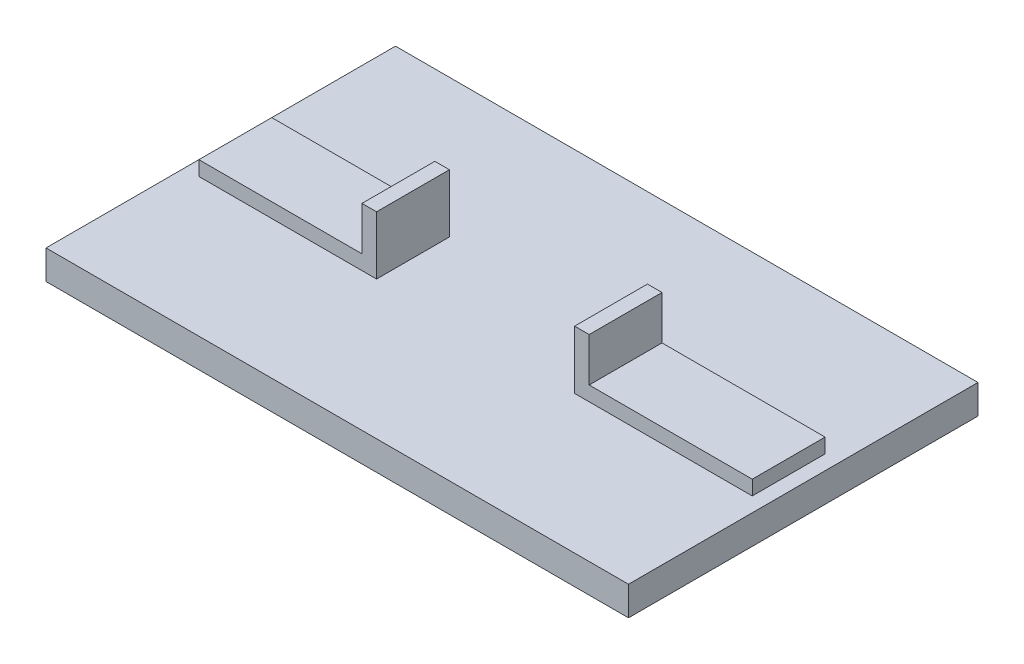
ISO-10303-21;
HEADER;
FILE_DESCRIPTION(('STEP AP214'),'2;1');
FILE_NAME('part.step','',(''),(''),'','','');
FILE_SCHEMA(('AUTOMOTIVE_DESIGN { 1 0 10303 214 1 1 1 1 }'));
ENDSEC;
DATA;
#1=APPLICATION_CONTEXT('core data for automotive mechanical design processes');
#2=APPLICATION_PROTOCOL_DEFINITION('international standard','automotive_design',2000,#1);
#3=PRODUCT_CONTEXT('',#1,'mechanical');
#4=PRODUCT('Part','Part','',(#3));
#5=PRODUCT_RELATED_PRODUCT_CATEGORY('part','',(#4));
#6=PRODUCT_DEFINITION_FORMATION('','',#4);
#7=PRODUCT_DEFINITION_CONTEXT('part definition',#1,'design');
#8=PRODUCT_DEFINITION('design','',#6,#7);
#9=PRODUCT_DEFINITION_SHAPE('','',#8);
#10=(LENGTH_UNIT() NAMED_UNIT(*) SI_UNIT(.MILLI.,.METRE.));
#11=(NAMED_UNIT(*) PLANE_ANGLE_UNIT() SI_UNIT($,.RADIAN.));
#12=(NAMED_UNIT(*) SI_UNIT($,.STERADIAN.) SOLID_ANGLE_UNIT());
#13=UNCERTAINTY_MEASURE_WITH_UNIT(LENGTH_MEASURE(1.E-05),#10,'distance_accuracy_value','');
#14=(GEOMETRIC_REPRESENTATION_CONTEXT(3) GLOBAL_UNCERTAINTY_ASSIGNED_CONTEXT((#13)) GLOBAL_UNIT_ASSIGNED_CONTEXT((#10,
#11,#12)) REPRESENTATION_CONTEXT('',''));
#15=CARTESIAN_POINT('',(0.,0.,0.));
#16=DIRECTION('',(0.,0.,1.));
#17=DIRECTION('',(1.,0.,0.));
#18=AXIS2_PLACEMENT_3D('',#15,#16,#17);
#19=CARTESIAN_POINT('',(0.,5.,0.));
#20=DIRECTION('',(0.,1.,0.));
#21=DIRECTION('',(0.,0.,1.));
#22=AXIS2_PLACEMENT_3D('',#19,#20,#21);
#23=PLANE('',#22);
#24=DIRECTION('',(0.,0.,-1.));
#25=VECTOR('',#24,1.);
#26=CARTESIAN_POINT('',(50.,5.,-30.));
#27=LINE('',#26,#25);
#28=CARTESIAN_POINT('',(50.,5.,30.));
#29=VERTEX_POINT('',#28);
#30=CARTESIAN_POINT('',(50.,5.,-30.));
#31=VERTEX_POINT('',#30);
#32=EDGE_CURVE('E309',#29,#31,#27,.T.);
#33=ORIENTED_EDGE('',*,*,#32,.T.);
#34=DIRECTION('',(-1.,0.,0.));
#35=VECTOR('',#34,1.);
#36=CARTESIAN_POINT('',(-50.,5.,-30.));
#37=LINE('',#36,#35);
#38=CARTESIAN_POINT('',(-50.,5.,-30.));
#39=VERTEX_POINT('',#38);
#40=EDGE_CURVE('E94',#31,#39,#37,.T.);
#41=ORIENTED_EDGE('',*,*,#40,.T.);
#42=DIRECTION('',(0.,0.,1.));
#43=VECTOR('',#42,1.);
#44=CARTESIAN_POINT('',(-50.,5.,-30.));
#45=LINE('',#44,#43);
#46=CARTESIAN_POINT('',(-50.,5.,30.));
#47=VERTEX_POINT('',#46);
#48=EDGE_CURVE('E314',#39,#47,#45,.T.);
#49=ORIENTED_EDGE('',*,*,#48,.T.);
#50=DIRECTION('',(1.,0.,0.));
#51=VECTOR('',#50,1.);
#52=CARTESIAN_POINT('',(-50.,5.,30.));
#53=LINE('',#52,#51);
#54=EDGE_CURVE('E63',#47,#29,#53,.T.);
#55=ORIENTED_EDGE('',*,*,#54,.T.);
#56=EDGE_LOOP('',(#33,#41,#49,#55));
#57=FACE_BOUND('',#56,.T.);
#58=DIRECTION('',(0.,0.,-1.));
#59=VECTOR('',#58,1.);
#60=CARTESIAN_POINT('',(-17.,5.,-6.254));
#61=LINE('',#60,#59);
#62=CARTESIAN_POINT('',(-17.,5.,6.254));
#63=VERTEX_POINT('',#62);
#64=CARTESIAN_POINT('',(-17.,5.,-6.254));
#65=VERTEX_POINT('',#64);
#66=EDGE_CURVE('E190',#63,#65,#61,.T.);
#67=ORIENTED_EDGE('',*,*,#66,.F.);
#68=DIRECTION('',(1.,0.,0.));
#69=VECTOR('',#68,1.);
#70=CARTESIAN_POINT('',(-19.5,5.,6.254));
#71=LINE('',#70,#69);
#72=CARTESIAN_POINT('',(-47.5,5.,6.254));
#73=VERTEX_POINT('',#72);
#74=EDGE_CURVE('E297',#73,#63,#71,.T.);
#75=ORIENTED_EDGE('',*,*,#74,.F.);
#76=DIRECTION('',(0.,0.,1.));
#77=VECTOR('',#76,1.);
#78=CARTESIAN_POINT('',(-47.5,5.,6.254));
#79=LINE('',#78,#77);
#80=CARTESIAN_POINT('',(-47.5,5.,-6.254));
#81=VERTEX_POINT('',#80);
#82=EDGE_CURVE('E179',#81,#73,#79,.T.);
#83=ORIENTED_EDGE('',*,*,#82,.F.);
#84=DIRECTION('',(-1.,0.,0.));
#85=VECTOR('',#84,1.);
#86=CARTESIAN_POINT('',(-47.5,5.,-6.254));
#87=LINE('',#86,#85);
#88=EDGE_CURVE('E282',#65,#81,#87,.T.);
#89=ORIENTED_EDGE('',*,*,#88,.F.);
#90=EDGE_LOOP('',(#67,#75,#83,#89));
#91=FACE_BOUND('',#90,.T.);
#92=DIRECTION('',(0.,0.,1.));
#93=VECTOR('',#92,1.);
#94=CARTESIAN_POINT('',(17.,5.,-6.254));
#95=LINE('',#94,#93);
#96=CARTESIAN_POINT('',(17.,5.,-6.254));
#97=VERTEX_POINT('',#96);
#98=CARTESIAN_POINT('',(17.,5.,6.25399999999999));
#99=VERTEX_POINT('',#98);
#100=EDGE_CURVE('E173',#97,#99,#95,.T.);
#101=ORIENTED_EDGE('',*,*,#100,.F.);
#102=DIRECTION('',(-1.,0.,0.));
#103=VECTOR('',#102,1.);
#104=CARTESIAN_POINT('',(47.5,5.,-6.25400000000001));
#105=LINE('',#104,#103);
#106=CARTESIAN_POINT('',(47.5,5.,-6.25400000000001));
#107=VERTEX_POINT('',#106);
#108=EDGE_CURVE('E258',#107,#97,#105,.T.);
#109=ORIENTED_EDGE('',*,*,#108,.F.);
#110=DIRECTION('',(0.,0.,-1.));
#111=VECTOR('',#110,1.);
#112=CARTESIAN_POINT('',(47.5,5.,6.25399999999999));
#113=LINE('',#112,#111);
#114=CARTESIAN_POINT('',(47.5,5.,6.25399999999999));
#115=VERTEX_POINT('',#114);
#116=EDGE_CURVE('E174',#115,#107,#113,.T.);
#117=ORIENTED_EDGE('',*,*,#116,.F.);
#118=DIRECTION('',(1.,0.,0.));
#119=VECTOR('',#118,1.);
#120=CARTESIAN_POINT('',(19.5,5.,6.25399999999999));
#121=LINE('',#120,#119);
#122=EDGE_CURVE('E170',#99,#115,#121,.T.);
#123=ORIENTED_EDGE('',*,*,#122,.F.);
#124=EDGE_LOOP('',(#101,#109,#117,#123));
#125=FACE_BOUND('',#124,.T.);
#126=ADVANCED_FACE('F45',(#57,#91,#125),#23,.T.);
#127=CARTESIAN_POINT('',(50.,5.,-30.));
#128=DIRECTION('',(-1.,0.,0.));
#129=DIRECTION('',(0.,0.,1.));
#130=AXIS2_PLACEMENT_3D('',#127,#128,#129);
#131=PLANE('',#130);
#132=DIRECTION('',(0.,0.,-1.));
#133=VECTOR('',#132,1.);
#134=CARTESIAN_POINT('',(50.,0.,-30.));
#135=LINE('',#134,#133);
#136=CARTESIAN_POINT('',(50.,0.,30.));
#137=VERTEX_POINT('',#136);
#138=CARTESIAN_POINT('',(50.,0.,-30.));
#139=VERTEX_POINT('',#138);
#140=EDGE_CURVE('E308',#137,#139,#135,.T.);
#141=ORIENTED_EDGE('',*,*,#140,.T.);
#142=DIRECTION('',(0.,-1.,0.));
#143=VECTOR('',#142,1.);
#144=CARTESIAN_POINT('',(50.,5.,-30.));
#145=LINE('',#144,#143);
#146=EDGE_CURVE('E11',#31,#139,#145,.T.);
#147=ORIENTED_EDGE('',*,*,#146,.F.);
#148=ORIENTED_EDGE('',*,*,#32,.F.);
#149=DIRECTION('',(0.,-1.,0.));
#150=VECTOR('',#149,1.);
#151=CARTESIAN_POINT('',(50.,5.,30.));
#152=LINE('',#151,#150);
#153=EDGE_CURVE('E319',#29,#137,#152,.T.);
#154=ORIENTED_EDGE('',*,*,#153,.T.);
#155=EDGE_LOOP('',(#141,#147,#148,#154));
#156=FACE_BOUND('',#155,.T.);
#157=ADVANCED_FACE('F47',(#156),#131,.F.);
#158=CARTESIAN_POINT('',(-50.,5.,-30.));
#159=DIRECTION('',(0.,0.,1.));
#160=DIRECTION('',(1.,0.,0.));
#161=AXIS2_PLACEMENT_3D('',#158,#159,#160);
#162=PLANE('',#161);
#163=DIRECTION('',(-1.,0.,0.));
#164=VECTOR('',#163,1.);
#165=CARTESIAN_POINT('',(-50.,0.,-30.));
#166=LINE('',#165,#164);
#167=CARTESIAN_POINT('',(-50.,0.,-30.));
#168=VERTEX_POINT('',#167);
#169=EDGE_CURVE('E323',#139,#168,#166,.T.);
#170=ORIENTED_EDGE('',*,*,#169,.T.);
#171=DIRECTION('',(0.,-1.,0.));
#172=VECTOR('',#171,1.);
#173=CARTESIAN_POINT('',(-50.,5.,-30.));
#174=LINE('',#173,#172);
#175=EDGE_CURVE('E55',#39,#168,#174,.T.);
#176=ORIENTED_EDGE('',*,*,#175,.F.);
#177=ORIENTED_EDGE('',*,*,#40,.F.);
#178=ORIENTED_EDGE('',*,*,#146,.T.);
#179=EDGE_LOOP('',(#170,#176,#177,#178));
#180=FACE_BOUND('',#179,.T.);
#181=ADVANCED_FACE('F352',(#180),#162,.F.);
#182=CARTESIAN_POINT('',(-50.,5.,-30.));
#183=DIRECTION('',(1.,0.,0.));
#184=DIRECTION('',(0.,0.,-1.));
#185=AXIS2_PLACEMENT_3D('',#182,#183,#184);
#186=PLANE('',#185);
#187=DIRECTION('',(0.,0.,1.));
#188=VECTOR('',#187,1.);
#189=CARTESIAN_POINT('',(-50.,0.,-30.));
#190=LINE('',#189,#188);
#191=CARTESIAN_POINT('',(-50.,0.,30.));
#192=VERTEX_POINT('',#191);
#193=EDGE_CURVE('E81',#168,#192,#190,.T.);
#194=ORIENTED_EDGE('',*,*,#193,.T.);
#195=DIRECTION('',(0.,-1.,0.));
#196=VECTOR('',#195,1.);
#197=CARTESIAN_POINT('',(-50.,5.,30.));
#198=LINE('',#197,#196);
#199=EDGE_CURVE('E332',#47,#192,#198,.T.);
#200=ORIENTED_EDGE('',*,*,#199,.F.);
#201=ORIENTED_EDGE('',*,*,#48,.F.);
#202=ORIENTED_EDGE('',*,*,#175,.T.);
#203=EDGE_LOOP('',(#194,#200,#201,#202));
#204=FACE_BOUND('',#203,.T.);
#205=ADVANCED_FACE('F336',(#204),#186,.F.);
#206=CARTESIAN_POINT('',(-50.,5.,30.));
#207=DIRECTION('',(0.,0.,-1.));
#208=DIRECTION('',(-1.,0.,0.));
#209=AXIS2_PLACEMENT_3D('',#206,#207,#208);
#210=PLANE('',#209);
#211=DIRECTION('',(1.,0.,0.));
#212=VECTOR('',#211,1.);
#213=CARTESIAN_POINT('',(-50.,0.,30.));
#214=LINE('',#213,#212);
#215=EDGE_CURVE('E87',#192,#137,#214,.T.);
#216=ORIENTED_EDGE('',*,*,#215,.T.);
#217=ORIENTED_EDGE('',*,*,#153,.F.);
#218=ORIENTED_EDGE('',*,*,#54,.F.);
#219=ORIENTED_EDGE('',*,*,#199,.T.);
#220=EDGE_LOOP('',(#216,#217,#218,#219));
#221=FACE_BOUND('',#220,.T.);
#222=ADVANCED_FACE('F343',(#221),#210,.F.);
#223=CARTESIAN_POINT('',(0.,0.,0.));
#224=DIRECTION('',(0.,1.,0.));
#225=DIRECTION('',(0.,0.,1.));
#226=AXIS2_PLACEMENT_3D('',#223,#224,#225);
#227=PLANE('',#226);
#228=ORIENTED_EDGE('',*,*,#140,.F.);
#229=ORIENTED_EDGE('',*,*,#215,.F.);
#230=ORIENTED_EDGE('',*,*,#193,.F.);
#231=ORIENTED_EDGE('',*,*,#169,.F.);
#232=EDGE_LOOP('',(#228,#229,#230,#231));
#233=FACE_BOUND('',#232,.T.);
#234=ADVANCED_FACE('F339',(#233),#227,.F.);
#235=CARTESIAN_POINT('',(-47.5,7.5,6.254));
#236=DIRECTION('',(1.,0.,0.));
#237=DIRECTION('',(0.,0.,-1.));
#238=AXIS2_PLACEMENT_3D('',#235,#236,#237);
#239=PLANE('',#238);
#240=ORIENTED_EDGE('',*,*,#82,.T.);
#241=DIRECTION('',(0.,-1.,0.));
#242=VECTOR('',#241,1.);
#243=CARTESIAN_POINT('',(-47.5,7.5,6.254));
#244=LINE('',#243,#242);
#245=CARTESIAN_POINT('',(-47.5,7.5,6.254));
#246=VERTEX_POINT('',#245);
#247=EDGE_CURVE('E305',#246,#73,#244,.T.);
#248=ORIENTED_EDGE('',*,*,#247,.F.);
#249=DIRECTION('',(0.,0.,1.));
#250=VECTOR('',#249,1.);
#251=CARTESIAN_POINT('',(-47.5,7.5,6.254));
#252=LINE('',#251,#250);
#253=CARTESIAN_POINT('',(-47.5,7.5,-6.254));
#254=VERTEX_POINT('',#253);
#255=EDGE_CURVE('E277',#254,#246,#252,.T.);
#256=ORIENTED_EDGE('',*,*,#255,.F.);
#257=DIRECTION('',(0.,-1.,0.));
#258=VECTOR('',#257,1.);
#259=CARTESIAN_POINT('',(-47.5,7.5,-6.254));
#260=LINE('',#259,#258);
#261=EDGE_CURVE('E293',#254,#81,#260,.T.);
#262=ORIENTED_EDGE('',*,*,#261,.T.);
#263=EDGE_LOOP('',(#240,#248,#256,#262));
#264=FACE_BOUND('',#263,.T.);
#265=ADVANCED_FACE('F350',(#264),#239,.F.);
#266=CARTESIAN_POINT('',(-19.5,7.5,6.254));
#267=DIRECTION('',(0.,0.,-1.));
#268=DIRECTION('',(-1.,0.,0.));
#269=AXIS2_PLACEMENT_3D('',#266,#267,#268);
#270=PLANE('',#269);
#271=ORIENTED_EDGE('',*,*,#74,.T.);
#272=DIRECTION('',(0.,-1.,0.));
#273=VECTOR('',#272,1.);
#274=CARTESIAN_POINT('',(-17.,15.,6.254));
#275=LINE('',#274,#273);
#276=CARTESIAN_POINT('',(-17.,15.,6.254));
#277=VERTEX_POINT('',#276);
#278=EDGE_CURVE('E242',#277,#63,#275,.T.);
#279=ORIENTED_EDGE('',*,*,#278,.F.);
#280=DIRECTION('',(1.,0.,0.));
#281=VECTOR('',#280,1.);
#282=CARTESIAN_POINT('',(-19.5,15.,6.254));
#283=LINE('',#282,#281);
#284=CARTESIAN_POINT('',(-19.5,15.,6.254));
#285=VERTEX_POINT('',#284);
#286=EDGE_CURVE('E223',#285,#277,#283,.T.);
#287=ORIENTED_EDGE('',*,*,#286,.F.);
#288=DIRECTION('',(0.,-1.,0.));
#289=VECTOR('',#288,1.);
#290=CARTESIAN_POINT('',(-19.5,15.,6.254));
#291=LINE('',#290,#289);
#292=CARTESIAN_POINT('',(-19.5,7.5,6.254));
#293=VERTEX_POINT('',#292);
#294=EDGE_CURVE('E246',#285,#293,#291,.T.);
#295=ORIENTED_EDGE('',*,*,#294,.T.);
#296=DIRECTION('',(1.,0.,0.));
#297=VECTOR('',#296,1.);
#298=CARTESIAN_POINT('',(-19.5,7.5,6.254));
#299=LINE('',#298,#297);
#300=EDGE_CURVE('E281',#246,#293,#299,.T.);
#301=ORIENTED_EDGE('',*,*,#300,.F.);
#302=ORIENTED_EDGE('',*,*,#247,.T.);
#303=EDGE_LOOP('',(#271,#279,#287,#295,#301,#302));
#304=FACE_BOUND('',#303,.T.);
#305=ADVANCED_FACE('F365',(#304),#270,.F.);
#306=CARTESIAN_POINT('',(-47.5,7.5,-6.254));
#307=DIRECTION('',(0.,0.,1.));
#308=DIRECTION('',(1.,0.,0.));
#309=AXIS2_PLACEMENT_3D('',#306,#307,#308);
#310=PLANE('',#309);
#311=ORIENTED_EDGE('',*,*,#88,.T.);
#312=ORIENTED_EDGE('',*,*,#261,.F.);
#313=DIRECTION('',(-1.,0.,0.));
#314=VECTOR('',#313,1.);
#315=CARTESIAN_POINT('',(-47.5,7.5,-6.254));
#316=LINE('',#315,#314);
#317=CARTESIAN_POINT('',(-19.5,7.5,-6.254));
#318=VERTEX_POINT('',#317);
#319=EDGE_CURVE('E290',#318,#254,#316,.T.);
#320=ORIENTED_EDGE('',*,*,#319,.F.);
#321=DIRECTION('',(0.,-1.,0.));
#322=VECTOR('',#321,1.);
#323=CARTESIAN_POINT('',(-19.5,15.,-6.254));
#324=LINE('',#323,#322);
#325=CARTESIAN_POINT('',(-19.5,15.,-6.254));
#326=VERTEX_POINT('',#325);
#327=EDGE_CURVE('E232',#326,#318,#324,.T.);
#328=ORIENTED_EDGE('',*,*,#327,.F.);
#329=DIRECTION('',(-1.,0.,0.));
#330=VECTOR('',#329,1.);
#331=CARTESIAN_POINT('',(-19.5,15.,-6.254));
#332=LINE('',#331,#330);
#333=CARTESIAN_POINT('',(-17.,15.,-6.254));
#334=VERTEX_POINT('',#333);
#335=EDGE_CURVE('E229',#334,#326,#332,.T.);
#336=ORIENTED_EDGE('',*,*,#335,.F.);
#337=DIRECTION('',(0.,-1.,0.));
#338=VECTOR('',#337,1.);
#339=CARTESIAN_POINT('',(-17.,15.,-6.254));
#340=LINE('',#339,#338);
#341=EDGE_CURVE('E238',#334,#65,#340,.T.);
#342=ORIENTED_EDGE('',*,*,#341,.T.);
#343=EDGE_LOOP('',(#311,#312,#320,#328,#336,#342));
#344=FACE_BOUND('',#343,.T.);
#345=ADVANCED_FACE('F368',(#344),#310,.F.);
#346=CARTESIAN_POINT('',(0.,7.5,0.));
#347=DIRECTION('',(0.,-1.,0.));
#348=DIRECTION('',(0.,0.,-1.));
#349=AXIS2_PLACEMENT_3D('',#346,#347,#348);
#350=PLANE('',#349);
#351=ORIENTED_EDGE('',*,*,#255,.T.);
#352=ORIENTED_EDGE('',*,*,#300,.T.);
#353=DIRECTION('',(0.,0.,-1.));
#354=VECTOR('',#353,1.);
#355=CARTESIAN_POINT('',(-19.5,7.5,-6.254));
#356=LINE('',#355,#354);
#357=EDGE_CURVE('E286',#293,#318,#356,.T.);
#358=ORIENTED_EDGE('',*,*,#357,.T.);
#359=ORIENTED_EDGE('',*,*,#319,.T.);
#360=EDGE_LOOP('',(#351,#352,#358,#359));
#361=FACE_BOUND('',#360,.T.);
#362=ADVANCED_FACE('F372',(#361),#350,.F.);
#363=CARTESIAN_POINT('',(19.5,7.5,6.25399999999999));
#364=DIRECTION('',(0.,0.,-1.));
#365=DIRECTION('',(-1.,0.,0.));
#366=AXIS2_PLACEMENT_3D('',#363,#364,#365);
#367=PLANE('',#366);
#368=ORIENTED_EDGE('',*,*,#122,.T.);
#369=DIRECTION('',(0.,-1.,0.));
#370=VECTOR('',#369,1.);
#371=CARTESIAN_POINT('',(47.5,7.5,6.25399999999999));
#372=LINE('',#371,#370);
#373=CARTESIAN_POINT('',(47.5,7.5,6.25399999999999));
#374=VERTEX_POINT('',#373);
#375=EDGE_CURVE('E250',#374,#115,#372,.T.);
#376=ORIENTED_EDGE('',*,*,#375,.F.);
#377=DIRECTION('',(1.,0.,0.));
#378=VECTOR('',#377,1.);
#379=CARTESIAN_POINT('',(19.5,7.5,6.25399999999999));
#380=LINE('',#379,#378);
#381=CARTESIAN_POINT('',(19.5,7.5,6.25399999999999));
#382=VERTEX_POINT('',#381);
#383=EDGE_CURVE('E261',#382,#374,#380,.T.);
#384=ORIENTED_EDGE('',*,*,#383,.F.);
#385=DIRECTION('',(0.,-1.,0.));
#386=VECTOR('',#385,1.);
#387=CARTESIAN_POINT('',(19.5,15.,6.25399999999999));
#388=LINE('',#387,#386);
#389=CARTESIAN_POINT('',(19.5,15.,6.25399999999999));
#390=VERTEX_POINT('',#389);
#391=EDGE_CURVE('E197',#390,#382,#388,.T.);
#392=ORIENTED_EDGE('',*,*,#391,.F.);
#393=DIRECTION('',(1.,0.,0.));
#394=VECTOR('',#393,1.);
#395=CARTESIAN_POINT('',(19.5,15.,6.25399999999999));
#396=LINE('',#395,#394);
#397=CARTESIAN_POINT('',(17.,15.,6.25399999999999));
#398=VERTEX_POINT('',#397);
#399=EDGE_CURVE('E195',#398,#390,#396,.T.);
#400=ORIENTED_EDGE('',*,*,#399,.F.);
#401=DIRECTION('',(0.,-1.,0.));
#402=VECTOR('',#401,1.);
#403=CARTESIAN_POINT('',(17.,15.,6.25399999999999));
#404=LINE('',#403,#402);
#405=EDGE_CURVE('E185',#398,#99,#404,.T.);
#406=ORIENTED_EDGE('',*,*,#405,.T.);
#407=EDGE_LOOP('',(#368,#376,#384,#392,#400,#406));
#408=FACE_BOUND('',#407,.T.);
#409=ADVANCED_FACE('F193',(#408),#367,.F.);
#410=CARTESIAN_POINT('',(47.5,7.5,6.25399999999999));
#411=DIRECTION('',(-1.,0.,0.));
#412=DIRECTION('',(0.,0.,1.));
#413=AXIS2_PLACEMENT_3D('',#410,#411,#412);
#414=PLANE('',#413);
#415=ORIENTED_EDGE('',*,*,#116,.T.);
#416=DIRECTION('',(0.,-1.,0.));
#417=VECTOR('',#416,1.);
#418=CARTESIAN_POINT('',(47.5,7.5,-6.25400000000001));
#419=LINE('',#418,#417);
#420=CARTESIAN_POINT('',(47.5,7.5,-6.25400000000001));
#421=VERTEX_POINT('',#420);
#422=EDGE_CURVE('E253',#421,#107,#419,.T.);
#423=ORIENTED_EDGE('',*,*,#422,.F.);
#424=DIRECTION('',(0.,0.,-1.));
#425=VECTOR('',#424,1.);
#426=CARTESIAN_POINT('',(47.5,7.5,6.25399999999999));
#427=LINE('',#426,#425);
#428=EDGE_CURVE('E271',#374,#421,#427,.T.);
#429=ORIENTED_EDGE('',*,*,#428,.F.);
#430=ORIENTED_EDGE('',*,*,#375,.T.);
#431=EDGE_LOOP('',(#415,#423,#429,#430));
#432=FACE_BOUND('',#431,.T.);
#433=ADVANCED_FACE('F385',(#432),#414,.F.);
#434=CARTESIAN_POINT('',(47.5,7.5,-6.25400000000001));
#435=DIRECTION('',(0.,0.,1.));
#436=DIRECTION('',(1.,0.,0.));
#437=AXIS2_PLACEMENT_3D('',#434,#435,#436);
#438=PLANE('',#437);
#439=ORIENTED_EDGE('',*,*,#108,.T.);
#440=DIRECTION('',(0.,-1.,0.));
#441=VECTOR('',#440,1.);
#442=CARTESIAN_POINT('',(17.,15.,-6.254));
#443=LINE('',#442,#441);
#444=CARTESIAN_POINT('',(17.,15.,-6.254));
#445=VERTEX_POINT('',#444);
#446=EDGE_CURVE('E188',#445,#97,#443,.T.);
#447=ORIENTED_EDGE('',*,*,#446,.F.);
#448=DIRECTION('',(-1.,0.,0.));
#449=VECTOR('',#448,1.);
#450=CARTESIAN_POINT('',(19.5,15.,-6.254));
#451=LINE('',#450,#449);
#452=CARTESIAN_POINT('',(19.5,15.,-6.254));
#453=VERTEX_POINT('',#452);
#454=EDGE_CURVE('E191',#453,#445,#451,.T.);
#455=ORIENTED_EDGE('',*,*,#454,.F.);
#456=DIRECTION('',(0.,-1.,0.));
#457=VECTOR('',#456,1.);
#458=CARTESIAN_POINT('',(19.5,15.,-6.254));
#459=LINE('',#458,#457);
#460=CARTESIAN_POINT('',(19.5,7.5,-6.254));
#461=VERTEX_POINT('',#460);
#462=EDGE_CURVE('E201',#453,#461,#459,.T.);
#463=ORIENTED_EDGE('',*,*,#462,.T.);
#464=DIRECTION('',(-1.,0.,0.));
#465=VECTOR('',#464,1.);
#466=CARTESIAN_POINT('',(47.5,7.5,-6.25400000000001));
#467=LINE('',#466,#465);
#468=EDGE_CURVE('E267',#421,#461,#467,.T.);
#469=ORIENTED_EDGE('',*,*,#468,.F.);
#470=ORIENTED_EDGE('',*,*,#422,.T.);
#471=EDGE_LOOP('',(#439,#447,#455,#463,#469,#470));
#472=FACE_BOUND('',#471,.T.);
#473=ADVANCED_FACE('F381',(#472),#438,.F.);
#474=CARTESIAN_POINT('',(0.,7.5,0.));
#475=DIRECTION('',(0.,1.,0.));
#476=DIRECTION('',(0.,0.,1.));
#477=AXIS2_PLACEMENT_3D('',#474,#475,#476);
#478=PLANE('',#477);
#479=ORIENTED_EDGE('',*,*,#383,.T.);
#480=ORIENTED_EDGE('',*,*,#428,.T.);
#481=ORIENTED_EDGE('',*,*,#468,.T.);
#482=DIRECTION('',(0.,0.,1.));
#483=VECTOR('',#482,1.);
#484=CARTESIAN_POINT('',(19.5,7.5,-6.254));
#485=LINE('',#484,#483);
#486=EDGE_CURVE('E257',#461,#382,#485,.T.);
#487=ORIENTED_EDGE('',*,*,#486,.T.);
#488=EDGE_LOOP('',(#479,#480,#481,#487));
#489=FACE_BOUND('',#488,.T.);
#490=ADVANCED_FACE('F377',(#489),#478,.T.);
#491=CARTESIAN_POINT('',(-19.5,15.,-6.254));
#492=DIRECTION('',(1.,0.,0.));
#493=DIRECTION('',(0.,0.,-1.));
#494=AXIS2_PLACEMENT_3D('',#491,#492,#493);
#495=PLANE('',#494);
#496=ORIENTED_EDGE('',*,*,#327,.T.);
#497=ORIENTED_EDGE('',*,*,#357,.F.);
#498=ORIENTED_EDGE('',*,*,#294,.F.);
#499=DIRECTION('',(0.,0.,1.));
#500=VECTOR('',#499,1.);
#501=CARTESIAN_POINT('',(-19.5,15.,-6.254));
#502=LINE('',#501,#500);
#503=EDGE_CURVE('E219',#326,#285,#502,.T.);
#504=ORIENTED_EDGE('',*,*,#503,.F.);
#505=EDGE_LOOP('',(#496,#497,#498,#504));
#506=FACE_BOUND('',#505,.T.);
#507=ADVANCED_FACE('F380',(#506),#495,.F.);
#508=CARTESIAN_POINT('',(-17.,15.,-6.254));
#509=DIRECTION('',(-1.,0.,0.));
#510=DIRECTION('',(0.,0.,1.));
#511=AXIS2_PLACEMENT_3D('',#508,#509,#510);
#512=PLANE('',#511);
#513=ORIENTED_EDGE('',*,*,#66,.T.);
#514=ORIENTED_EDGE('',*,*,#341,.F.);
#515=DIRECTION('',(0.,0.,-1.));
#516=VECTOR('',#515,1.);
#517=CARTESIAN_POINT('',(-17.,15.,-6.254));
#518=LINE('',#517,#516);
#519=EDGE_CURVE('E226',#277,#334,#518,.T.);
#520=ORIENTED_EDGE('',*,*,#519,.F.);
#521=ORIENTED_EDGE('',*,*,#278,.T.);
#522=EDGE_LOOP('',(#513,#514,#520,#521));
#523=FACE_BOUND('',#522,.T.);
#524=ADVANCED_FACE('F393',(#523),#512,.F.);
#525=CARTESIAN_POINT('',(0.,15.,0.));
#526=DIRECTION('',(0.,1.,0.));
#527=DIRECTION('',(0.,0.,1.));
#528=AXIS2_PLACEMENT_3D('',#525,#526,#527);
#529=PLANE('',#528);
#530=ORIENTED_EDGE('',*,*,#503,.T.);
#531=ORIENTED_EDGE('',*,*,#286,.T.);
#532=ORIENTED_EDGE('',*,*,#519,.T.);
#533=ORIENTED_EDGE('',*,*,#335,.T.);
#534=EDGE_LOOP('',(#530,#531,#532,#533));
#535=FACE_BOUND('',#534,.T.);
#536=ADVANCED_FACE('F397',(#535),#529,.T.);
#537=CARTESIAN_POINT('',(17.,15.,-6.254));
#538=DIRECTION('',(1.,0.,0.));
#539=DIRECTION('',(0.,0.,-1.));
#540=AXIS2_PLACEMENT_3D('',#537,#538,#539);
#541=PLANE('',#540);
#542=ORIENTED_EDGE('',*,*,#100,.T.);
#543=ORIENTED_EDGE('',*,*,#405,.F.);
#544=DIRECTION('',(0.,0.,1.));
#545=VECTOR('',#544,1.);
#546=CARTESIAN_POINT('',(17.,15.,-6.254));
#547=LINE('',#546,#545);
#548=EDGE_CURVE('E213',#445,#398,#547,.T.);
#549=ORIENTED_EDGE('',*,*,#548,.F.);
#550=ORIENTED_EDGE('',*,*,#446,.T.);
#551=EDGE_LOOP('',(#542,#543,#549,#550));
#552=FACE_BOUND('',#551,.T.);
#553=ADVANCED_FACE('F184',(#552),#541,.F.);
#554=CARTESIAN_POINT('',(19.5,15.,-6.254));
#555=DIRECTION('',(-1.,0.,0.));
#556=DIRECTION('',(0.,0.,1.));
#557=AXIS2_PLACEMENT_3D('',#554,#555,#556);
#558=PLANE('',#557);
#559=ORIENTED_EDGE('',*,*,#486,.F.);
#560=ORIENTED_EDGE('',*,*,#462,.F.);
#561=DIRECTION('',(0.,0.,-1.));
#562=VECTOR('',#561,1.);
#563=CARTESIAN_POINT('',(19.5,15.,-6.254));
#564=LINE('',#563,#562);
#565=EDGE_CURVE('E207',#390,#453,#564,.T.);
#566=ORIENTED_EDGE('',*,*,#565,.F.);
#567=ORIENTED_EDGE('',*,*,#391,.T.);
#568=EDGE_LOOP('',(#559,#560,#566,#567));
#569=FACE_BOUND('',#568,.T.);
#570=ADVANCED_FACE('F405',(#569),#558,.F.);
#571=CARTESIAN_POINT('',(0.,15.,0.));
#572=DIRECTION('',(0.,1.,0.));
#573=DIRECTION('',(0.,0.,1.));
#574=AXIS2_PLACEMENT_3D('',#571,#572,#573);
#575=PLANE('',#574);
#576=ORIENTED_EDGE('',*,*,#454,.T.);
#577=ORIENTED_EDGE('',*,*,#548,.T.);
#578=ORIENTED_EDGE('',*,*,#399,.T.);
#579=ORIENTED_EDGE('',*,*,#565,.T.);
#580=EDGE_LOOP('',(#576,#577,#578,#579));
#581=FACE_BOUND('',#580,.T.);
#582=ADVANCED_FACE('F402',(#581),#575,.T.);
#583=CLOSED_SHELL('',(#126,#157,#181,#205,#222,#234,#265,#305,#345,#362,#409,#433,#473,#490,
#507,#524,#536,#553,#570,#582));
#584=MANIFOLD_SOLID_BREP('B2',#583);
#585=ADVANCED_BREP_SHAPE_REPRESENTATION('',(#18,#584),#14);
#586=SHAPE_DEFINITION_REPRESENTATION(#9,#585);
ENDSEC;
END-ISO-10303-21;
